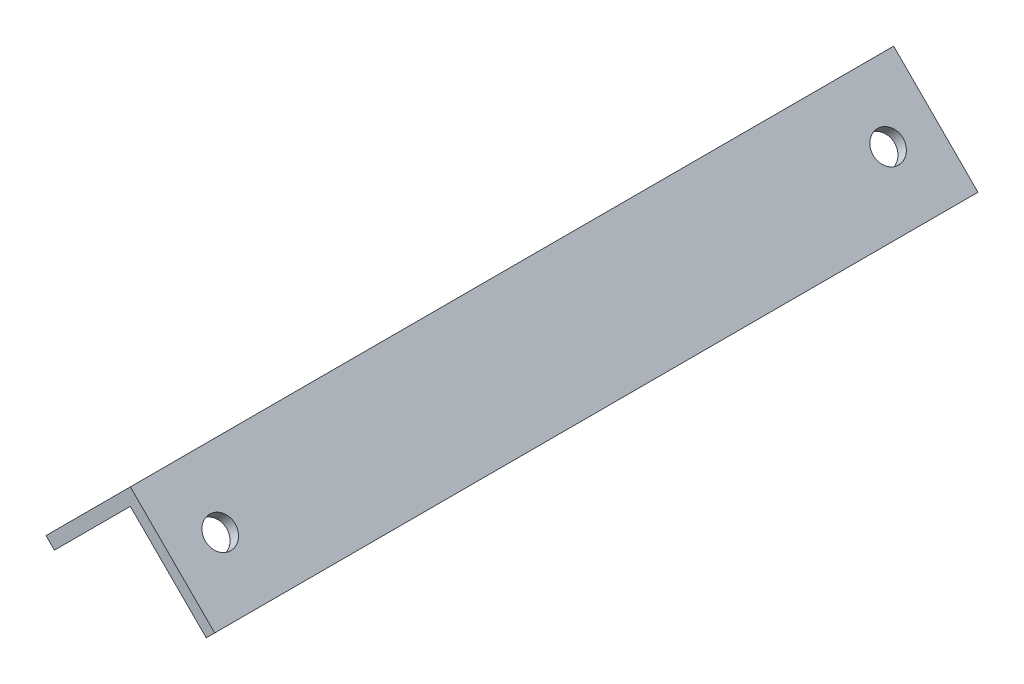
ISO-10303-21;
HEADER;
FILE_DESCRIPTION(('STEP AP214'),'2;1');
FILE_NAME('part.step','',(''),(''),'','','');
FILE_SCHEMA(('AUTOMOTIVE_DESIGN { 1 0 10303 214 1 1 1 1 }'));
ENDSEC;
DATA;
#1=APPLICATION_CONTEXT('core data for automotive mechanical design processes');
#2=APPLICATION_PROTOCOL_DEFINITION('international standard','automotive_design',2000,#1);
#3=PRODUCT_CONTEXT('',#1,'mechanical');
#4=PRODUCT('Part','Part','',(#3));
#5=PRODUCT_RELATED_PRODUCT_CATEGORY('part','',(#4));
#6=PRODUCT_DEFINITION_FORMATION('','',#4);
#7=PRODUCT_DEFINITION_CONTEXT('part definition',#1,'design');
#8=PRODUCT_DEFINITION('design','',#6,#7);
#9=PRODUCT_DEFINITION_SHAPE('','',#8);
#10=(LENGTH_UNIT() NAMED_UNIT(*) SI_UNIT(.MILLI.,.METRE.));
#11=(NAMED_UNIT(*) PLANE_ANGLE_UNIT() SI_UNIT($,.RADIAN.));
#12=(NAMED_UNIT(*) SI_UNIT($,.STERADIAN.) SOLID_ANGLE_UNIT());
#13=UNCERTAINTY_MEASURE_WITH_UNIT(LENGTH_MEASURE(1.E-05),#10,'distance_accuracy_value','');
#14=(GEOMETRIC_REPRESENTATION_CONTEXT(3) GLOBAL_UNCERTAINTY_ASSIGNED_CONTEXT((#13)) GLOBAL_UNIT_ASSIGNED_CONTEXT((#10,
#11,#12)) REPRESENTATION_CONTEXT('',''));
#15=CARTESIAN_POINT('',(0.,0.,0.));
#16=DIRECTION('',(0.,0.,1.));
#17=DIRECTION('',(1.,0.,0.));
#18=AXIS2_PLACEMENT_3D('',#15,#16,#17);
#19=CARTESIAN_POINT('',(42.6562165750785,-2.24506403026729,203.2));
#20=DIRECTION('',(0.707106781186548,0.707106781186547,0.));
#21=DIRECTION('',(-0.707106781186547,0.707106781186548,0.));
#22=AXIS2_PLACEMENT_3D('',#19,#20,#21);
#23=PLANE('',#22);
#24=DIRECTION('',(0.707106781186547,-0.707106781186548,0.));
#25=VECTOR('',#24,1.);
#26=CARTESIAN_POINT('',(42.6562165750785,-2.24506403026729,0.));
#27=LINE('',#26,#25);
#28=CARTESIAN_POINT('',(22.4506403026729,17.9605122421383,0.));
#29=VERTEX_POINT('',#28);
#30=CARTESIAN_POINT('',(42.6562165750785,-2.24506403026729,0.));
#31=VERTEX_POINT('',#30);
#32=EDGE_CURVE('E126',#29,#31,#27,.T.);
#33=ORIENTED_EDGE('',*,*,#32,.T.);
#34=DIRECTION('',(0.,0.,-1.));
#35=VECTOR('',#34,1.);
#36=CARTESIAN_POINT('',(42.6562165750785,-2.24506403026729,203.2));
#37=LINE('',#36,#35);
#38=CARTESIAN_POINT('',(42.6562165750785,-2.24506403026729,203.2));
#39=VERTEX_POINT('',#38);
#40=EDGE_CURVE('E110',#39,#31,#37,.T.);
#41=ORIENTED_EDGE('',*,*,#40,.F.);
#42=DIRECTION('',(0.707106781186547,-0.707106781186548,0.));
#43=VECTOR('',#42,1.);
#44=CARTESIAN_POINT('',(42.6562165750785,-2.24506403026729,203.2));
#45=LINE('',#44,#43);
#46=CARTESIAN_POINT('',(22.4506403026729,17.9605122421383,203.2));
#47=VERTEX_POINT('',#46);
#48=EDGE_CURVE('E101',#47,#39,#45,.T.);
#49=ORIENTED_EDGE('',*,*,#48,.F.);
#50=DIRECTION('',(0.,0.,-1.));
#51=VECTOR('',#50,1.);
#52=CARTESIAN_POINT('',(22.4506403026729,17.9605122421383,203.2));
#53=LINE('',#52,#51);
#54=EDGE_CURVE('E43',#47,#29,#53,.T.);
#55=ORIENTED_EDGE('',*,*,#54,.T.);
#56=EDGE_LOOP('',(#33,#41,#49,#55));
#57=FACE_BOUND('',#56,.T.);
#58=CARTESIAN_POINT('',(31.430896423742,8.98025612106917,12.7));
#59=DIRECTION('',(0.707106781186548,0.707106781186547,0.));
#60=DIRECTION('',(-0.707106781186547,0.707106781186548,0.));
#61=AXIS2_PLACEMENT_3D('',#58,#59,#60);
#62=CIRCLE('',#61,3.9751);
#63=CARTESIAN_POINT('',(28.6200762578474,11.7910762869638,12.7));
#64=VERTEX_POINT('',#63);
#65=EDGE_CURVE('E187',#64,#64,#62,.T.);
#66=ORIENTED_EDGE('',*,*,#65,.T.);
#67=EDGE_LOOP('',(#66));
#68=FACE_BOUND('',#67,.T.);
#69=CARTESIAN_POINT('',(31.430896423742,8.98025612106917,190.5));
#70=DIRECTION('',(0.707106781186548,0.707106781186547,0.));
#71=DIRECTION('',(-0.707106781186547,0.707106781186548,0.));
#72=AXIS2_PLACEMENT_3D('',#69,#70,#71);
#73=CIRCLE('',#72,3.9751);
#74=CARTESIAN_POINT('',(28.6200762578474,11.7910762869638,190.5));
#75=VERTEX_POINT('',#74);
#76=EDGE_CURVE('E193',#75,#75,#73,.F.);
#77=ORIENTED_EDGE('',*,*,#76,.F.);
#78=EDGE_LOOP('',(#77));
#79=FACE_BOUND('',#78,.T.);
#80=ADVANCED_FACE('F34',(#57,#68,#79),#23,.F.);
#81=CARTESIAN_POINT('',(22.4506403026729,22.4506403026729,203.2));
#82=DIRECTION('',(-0.707106781186548,-0.707106781186548,0.));
#83=DIRECTION('',(0.707106781186548,-0.707106781186547,0.));
#84=AXIS2_PLACEMENT_3D('',#81,#82,#83);
#85=PLANE('',#84);
#86=DIRECTION('',(-0.707106781186547,0.707106781186547,0.));
#87=VECTOR('',#86,1.);
#88=CARTESIAN_POINT('',(22.4506403026729,22.4506403026729,0.));
#89=LINE('',#88,#87);
#90=CARTESIAN_POINT('',(44.9012806053458,0.,0.));
#91=VERTEX_POINT('',#90);
#92=CARTESIAN_POINT('',(22.4506403026729,22.4506403026729,0.));
#93=VERTEX_POINT('',#92);
#94=EDGE_CURVE('E74',#91,#93,#89,.T.);
#95=ORIENTED_EDGE('',*,*,#94,.T.);
#96=DIRECTION('',(0.,0.,-1.));
#97=VECTOR('',#96,1.);
#98=CARTESIAN_POINT('',(22.4506403026729,22.4506403026729,203.2));
#99=LINE('',#98,#97);
#100=CARTESIAN_POINT('',(22.4506403026729,22.4506403026729,203.2));
#101=VERTEX_POINT('',#100);
#102=EDGE_CURVE('E111',#101,#93,#99,.T.);
#103=ORIENTED_EDGE('',*,*,#102,.F.);
#104=DIRECTION('',(-0.707106781186547,0.707106781186547,0.));
#105=VECTOR('',#104,1.);
#106=CARTESIAN_POINT('',(22.4506403026729,22.4506403026729,203.2));
#107=LINE('',#106,#105);
#108=CARTESIAN_POINT('',(44.9012806053458,0.,203.2));
#109=VERTEX_POINT('',#108);
#110=EDGE_CURVE('E99',#109,#101,#107,.T.);
#111=ORIENTED_EDGE('',*,*,#110,.F.);
#112=DIRECTION('',(0.,0.,-1.));
#113=VECTOR('',#112,1.);
#114=CARTESIAN_POINT('',(44.9012806053458,0.,203.2));
#115=LINE('',#114,#113);
#116=EDGE_CURVE('E106',#109,#91,#115,.T.);
#117=ORIENTED_EDGE('',*,*,#116,.T.);
#118=EDGE_LOOP('',(#95,#103,#111,#117));
#119=FACE_BOUND('',#118,.T.);
#120=CARTESIAN_POINT('',(33.6759604540093,11.2253201513365,12.7));
#121=DIRECTION('',(0.707106781186547,0.707106781186548,0.));
#122=DIRECTION('',(-0.707106781186548,0.707106781186547,0.));
#123=AXIS2_PLACEMENT_3D('',#120,#121,#122);
#124=CIRCLE('',#123,3.9751);
#125=CARTESIAN_POINT('',(30.8651402881147,14.0361403172311,12.7));
#126=VERTEX_POINT('',#125);
#127=EDGE_CURVE('E190',#126,#126,#124,.T.);
#128=ORIENTED_EDGE('',*,*,#127,.F.);
#129=EDGE_LOOP('',(#128));
#130=FACE_BOUND('',#129,.T.);
#131=CARTESIAN_POINT('',(33.6759604540093,11.2253201513365,190.5));
#132=DIRECTION('',(-0.707106781186547,-0.707106781186548,0.));
#133=DIRECTION('',(-0.707106781186548,0.707106781186547,0.));
#134=AXIS2_PLACEMENT_3D('',#131,#132,#133);
#135=CIRCLE('',#134,3.9751);
#136=CARTESIAN_POINT('',(30.8651402881147,14.0361403172311,190.5));
#137=VERTEX_POINT('',#136);
#138=EDGE_CURVE('E196',#137,#137,#135,.T.);
#139=ORIENTED_EDGE('',*,*,#138,.T.);
#140=EDGE_LOOP('',(#139));
#141=FACE_BOUND('',#140,.T.);
#142=ADVANCED_FACE('F113',(#119,#130,#141),#85,.F.);
#143=CARTESIAN_POINT('',(2.24506403026729,-2.24506403026729,203.2));
#144=DIRECTION('',(0.707106781186547,0.707106781186548,0.));
#145=DIRECTION('',(-0.707106781186548,0.707106781186547,0.));
#146=AXIS2_PLACEMENT_3D('',#143,#144,#145);
#147=PLANE('',#146);
#148=DIRECTION('',(0.707106781186548,-0.707106781186547,0.));
#149=VECTOR('',#148,1.);
#150=CARTESIAN_POINT('',(2.24506403026729,-2.24506403026729,0.));
#151=LINE('',#150,#149);
#152=CARTESIAN_POINT('',(0.,0.,0.));
#153=VERTEX_POINT('',#152);
#154=CARTESIAN_POINT('',(2.24506403026729,-2.24506403026729,0.));
#155=VERTEX_POINT('',#154);
#156=EDGE_CURVE('E120',#153,#155,#151,.T.);
#157=ORIENTED_EDGE('',*,*,#156,.T.);
#158=DIRECTION('',(0.,0.,-1.));
#159=VECTOR('',#158,1.);
#160=CARTESIAN_POINT('',(2.24506403026729,-2.24506403026729,203.2));
#161=LINE('',#160,#159);
#162=CARTESIAN_POINT('',(2.24506403026729,-2.24506403026729,203.2));
#163=VERTEX_POINT('',#162);
#164=EDGE_CURVE('E11',#163,#155,#161,.T.);
#165=ORIENTED_EDGE('',*,*,#164,.F.);
#166=DIRECTION('',(0.707106781186548,-0.707106781186547,0.));
#167=VECTOR('',#166,1.);
#168=CARTESIAN_POINT('',(2.24506403026729,-2.24506403026729,203.2));
#169=LINE('',#168,#167);
#170=CARTESIAN_POINT('',(0.,0.,203.2));
#171=VERTEX_POINT('',#170);
#172=EDGE_CURVE('E131',#171,#163,#169,.T.);
#173=ORIENTED_EDGE('',*,*,#172,.F.);
#174=DIRECTION('',(0.,0.,-1.));
#175=VECTOR('',#174,1.);
#176=CARTESIAN_POINT('',(0.,0.,203.2));
#177=LINE('',#176,#175);
#178=EDGE_CURVE('E116',#171,#153,#177,.T.);
#179=ORIENTED_EDGE('',*,*,#178,.T.);
#180=EDGE_LOOP('',(#157,#165,#173,#179));
#181=FACE_BOUND('',#180,.T.);
#182=ADVANCED_FACE('F36',(#181),#147,.F.);
#183=CARTESIAN_POINT('',(22.4506403026729,17.9605122421383,203.2));
#184=DIRECTION('',(-0.707106781186548,0.707106781186548,0.));
#185=DIRECTION('',(-0.707106781186548,-0.707106781186547,0.));
#186=AXIS2_PLACEMENT_3D('',#183,#184,#185);
#187=PLANE('',#186);
#188=CARTESIAN_POINT('',(13.4703841816037,8.98025612106914,171.45));
#189=DIRECTION('',(-0.707106781186548,0.707106781186548,0.));
#190=DIRECTION('',(-0.707106781186548,-0.707106781186547,0.));
#191=AXIS2_PLACEMENT_3D('',#188,#189,#190);
#192=CIRCLE('',#191,3.97510000000001);
#193=CARTESIAN_POINT('',(10.6595640157091,6.16943595517449,171.45));
#194=VERTEX_POINT('',#193);
#195=EDGE_CURVE('E172',#194,#194,#192,.T.);
#196=ORIENTED_EDGE('',*,*,#195,.T.);
#197=EDGE_LOOP('',(#196));
#198=FACE_BOUND('',#197,.T.);
#199=CARTESIAN_POINT('',(13.4703841816037,8.98025612106914,31.75));
#200=DIRECTION('',(-0.707106781186548,0.707106781186548,0.));
#201=DIRECTION('',(-0.707106781186548,-0.707106781186547,0.));
#202=AXIS2_PLACEMENT_3D('',#199,#200,#201);
#203=CIRCLE('',#202,3.9751);
#204=CARTESIAN_POINT('',(10.6595640157091,6.1694359551745,31.75));
#205=VERTEX_POINT('',#204);
#206=EDGE_CURVE('E124',#205,#205,#203,.T.);
#207=ORIENTED_EDGE('',*,*,#206,.T.);
#208=EDGE_LOOP('',(#207));
#209=FACE_BOUND('',#208,.T.);
#210=DIRECTION('',(0.707106781186547,0.707106781186547,0.));
#211=VECTOR('',#210,1.);
#212=CARTESIAN_POINT('',(22.4506403026729,17.9605122421383,0.));
#213=LINE('',#212,#211);
#214=EDGE_CURVE('E123',#155,#29,#213,.T.);
#215=ORIENTED_EDGE('',*,*,#214,.T.);
#216=ORIENTED_EDGE('',*,*,#54,.F.);
#217=DIRECTION('',(0.707106781186547,0.707106781186547,0.));
#218=VECTOR('',#217,1.);
#219=CARTESIAN_POINT('',(22.4506403026729,17.9605122421383,203.2));
#220=LINE('',#219,#218);
#221=EDGE_CURVE('E88',#163,#47,#220,.T.);
#222=ORIENTED_EDGE('',*,*,#221,.F.);
#223=ORIENTED_EDGE('',*,*,#164,.T.);
#224=EDGE_LOOP('',(#215,#216,#222,#223));
#225=FACE_BOUND('',#224,.T.);
#226=ADVANCED_FACE('F153',(#198,#209,#225),#187,.F.);
#227=CARTESIAN_POINT('',(44.9012806053458,0.,203.2));
#228=DIRECTION('',(-0.707106781186547,0.707106781186548,0.));
#229=DIRECTION('',(-0.707106781186548,-0.707106781186547,0.));
#230=AXIS2_PLACEMENT_3D('',#227,#228,#229);
#231=PLANE('',#230);
#232=DIRECTION('',(0.707106781186548,0.707106781186547,0.));
#233=VECTOR('',#232,1.);
#234=CARTESIAN_POINT('',(44.9012806053458,0.,0.));
#235=LINE('',#234,#233);
#236=EDGE_CURVE('E109',#31,#91,#235,.T.);
#237=ORIENTED_EDGE('',*,*,#236,.T.);
#238=ORIENTED_EDGE('',*,*,#116,.F.);
#239=DIRECTION('',(0.707106781186548,0.707106781186547,0.));
#240=VECTOR('',#239,1.);
#241=CARTESIAN_POINT('',(44.9012806053458,0.,203.2));
#242=LINE('',#241,#240);
#243=EDGE_CURVE('E95',#39,#109,#242,.T.);
#244=ORIENTED_EDGE('',*,*,#243,.F.);
#245=ORIENTED_EDGE('',*,*,#40,.T.);
#246=EDGE_LOOP('',(#237,#238,#244,#245));
#247=FACE_BOUND('',#246,.T.);
#248=ADVANCED_FACE('F107',(#247),#231,.F.);
#249=CARTESIAN_POINT('',(0.,0.,203.2));
#250=DIRECTION('',(0.707106781186548,-0.707106781186547,0.));
#251=DIRECTION('',(0.707106781186547,0.707106781186548,0.));
#252=AXIS2_PLACEMENT_3D('',#249,#250,#251);
#253=PLANE('',#252);
#254=CARTESIAN_POINT('',(11.2253201513364,11.2253201513364,171.45));
#255=DIRECTION('',(-0.707106781186548,0.707106781186547,0.));
#256=DIRECTION('',(-0.707106781186547,-0.707106781186548,0.));
#257=AXIS2_PLACEMENT_3D('',#254,#255,#256);
#258=CIRCLE('',#257,3.97510000000001);
#259=CARTESIAN_POINT('',(8.41449998544178,8.41449998544179,171.45));
#260=VERTEX_POINT('',#259);
#261=EDGE_CURVE('E184',#260,#260,#258,.T.);
#262=ORIENTED_EDGE('',*,*,#261,.F.);
#263=EDGE_LOOP('',(#262));
#264=FACE_BOUND('',#263,.T.);
#265=CARTESIAN_POINT('',(11.2253201513364,11.2253201513364,31.75));
#266=DIRECTION('',(-0.707106781186548,0.707106781186547,0.));
#267=DIRECTION('',(-0.707106781186547,-0.707106781186548,0.));
#268=AXIS2_PLACEMENT_3D('',#265,#266,#267);
#269=CIRCLE('',#268,3.9751);
#270=CARTESIAN_POINT('',(8.41449998544179,8.41449998544179,31.75));
#271=VERTEX_POINT('',#270);
#272=EDGE_CURVE('E176',#271,#271,#269,.T.);
#273=ORIENTED_EDGE('',*,*,#272,.F.);
#274=EDGE_LOOP('',(#273));
#275=FACE_BOUND('',#274,.T.);
#276=DIRECTION('',(-0.707106781186547,-0.707106781186548,0.));
#277=VECTOR('',#276,1.);
#278=CARTESIAN_POINT('',(0.,0.,0.));
#279=LINE('',#278,#277);
#280=EDGE_CURVE('E80',#93,#153,#279,.T.);
#281=ORIENTED_EDGE('',*,*,#280,.T.);
#282=ORIENTED_EDGE('',*,*,#178,.F.);
#283=DIRECTION('',(-0.707106781186547,-0.707106781186548,0.));
#284=VECTOR('',#283,1.);
#285=CARTESIAN_POINT('',(0.,0.,203.2));
#286=LINE('',#285,#284);
#287=EDGE_CURVE('E51',#101,#171,#286,.T.);
#288=ORIENTED_EDGE('',*,*,#287,.F.);
#289=ORIENTED_EDGE('',*,*,#102,.T.);
#290=EDGE_LOOP('',(#281,#282,#288,#289));
#291=FACE_BOUND('',#290,.T.);
#292=ADVANCED_FACE('F144',(#264,#275,#291),#253,.F.);
#293=CARTESIAN_POINT('',(0.,0.,203.2));
#294=DIRECTION('',(0.,0.,-1.));
#295=DIRECTION('',(-1.,0.,0.));
#296=AXIS2_PLACEMENT_3D('',#293,#294,#295);
#297=PLANE('',#296);
#298=ORIENTED_EDGE('',*,*,#172,.T.);
#299=ORIENTED_EDGE('',*,*,#221,.T.);
#300=ORIENTED_EDGE('',*,*,#48,.T.);
#301=ORIENTED_EDGE('',*,*,#243,.T.);
#302=ORIENTED_EDGE('',*,*,#110,.T.);
#303=ORIENTED_EDGE('',*,*,#287,.T.);
#304=EDGE_LOOP('',(#298,#299,#300,#301,#302,#303));
#305=FACE_BOUND('',#304,.T.);
#306=ADVANCED_FACE('F97',(#305),#297,.F.);
#307=CARTESIAN_POINT('',(0.,0.,0.));
#308=DIRECTION('',(0.,0.,-1.));
#309=DIRECTION('',(-1.,0.,0.));
#310=AXIS2_PLACEMENT_3D('',#307,#308,#309);
#311=PLANE('',#310);
#312=ORIENTED_EDGE('',*,*,#156,.F.);
#313=ORIENTED_EDGE('',*,*,#280,.F.);
#314=ORIENTED_EDGE('',*,*,#94,.F.);
#315=ORIENTED_EDGE('',*,*,#236,.F.);
#316=ORIENTED_EDGE('',*,*,#32,.F.);
#317=ORIENTED_EDGE('',*,*,#214,.F.);
#318=EDGE_LOOP('',(#312,#313,#314,#315,#316,#317));
#319=FACE_BOUND('',#318,.T.);
#320=ADVANCED_FACE('F140',(#319),#311,.T.);
#321=CARTESIAN_POINT('',(34.798492469143,-12.3478521664701,31.75));
#322=DIRECTION('',(-0.707106781186548,0.707106781186547,0.));
#323=DIRECTION('',(-0.707106781186547,-0.707106781186548,0.));
#324=AXIS2_PLACEMENT_3D('',#321,#322,#323);
#325=CYLINDRICAL_SURFACE('',#324,3.9751);
#326=ORIENTED_EDGE('',*,*,#272,.T.);
#327=EDGE_LOOP('',(#326));
#328=FACE_BOUND('',#327,.T.);
#329=ORIENTED_EDGE('',*,*,#206,.F.);
#330=EDGE_LOOP('',(#329));
#331=FACE_BOUND('',#330,.T.);
#332=ADVANCED_FACE('F217',(#328,#331),#325,.F.);
#333=CARTESIAN_POINT('',(34.798492469143,-12.3478521664701,171.45));
#334=DIRECTION('',(-0.707106781186548,0.707106781186547,0.));
#335=DIRECTION('',(-0.707106781186547,-0.707106781186548,0.));
#336=AXIS2_PLACEMENT_3D('',#333,#334,#335);
#337=CYLINDRICAL_SURFACE('',#336,3.97510000000001);
#338=ORIENTED_EDGE('',*,*,#261,.T.);
#339=EDGE_LOOP('',(#338));
#340=FACE_BOUND('',#339,.T.);
#341=ORIENTED_EDGE('',*,*,#195,.F.);
#342=EDGE_LOOP('',(#341));
#343=FACE_BOUND('',#342,.T.);
#344=ADVANCED_FACE('F211',(#340,#343),#337,.F.);
#345=CARTESIAN_POINT('',(10.1027881362028,-12.3478521664701,12.7));
#346=DIRECTION('',(0.707106781186547,0.707106781186548,0.));
#347=DIRECTION('',(-0.707106781186548,0.707106781186547,0.));
#348=AXIS2_PLACEMENT_3D('',#345,#346,#347);
#349=CYLINDRICAL_SURFACE('',#348,3.9751);
#350=ORIENTED_EDGE('',*,*,#127,.T.);
#351=EDGE_LOOP('',(#350));
#352=FACE_BOUND('',#351,.T.);
#353=ORIENTED_EDGE('',*,*,#65,.F.);
#354=EDGE_LOOP('',(#353));
#355=FACE_BOUND('',#354,.T.);
#356=ADVANCED_FACE('F204',(#352,#355),#349,.F.);
#357=CARTESIAN_POINT('',(10.1027881362028,-12.3478521664701,190.5));
#358=DIRECTION('',(0.707106781186547,0.707106781186548,0.));
#359=DIRECTION('',(-0.707106781186548,0.707106781186547,0.));
#360=AXIS2_PLACEMENT_3D('',#357,#358,#359);
#361=CYLINDRICAL_SURFACE('',#360,3.9751);
#362=ORIENTED_EDGE('',*,*,#138,.F.);
#363=EDGE_LOOP('',(#362));
#364=FACE_BOUND('',#363,.T.);
#365=ORIENTED_EDGE('',*,*,#76,.T.);
#366=EDGE_LOOP('',(#365));
#367=FACE_BOUND('',#366,.T.);
#368=ADVANCED_FACE('F201',(#364,#367),#361,.F.);
#369=CLOSED_SHELL('',(#80,#142,#182,#226,#248,#292,#306,#320,#332,#344,#356,#368));
#370=MANIFOLD_SOLID_BREP('B2',#369);
#371=ADVANCED_BREP_SHAPE_REPRESENTATION('',(#18,#370),#14);
#372=SHAPE_DEFINITION_REPRESENTATION(#9,#371);
ENDSEC;
END-ISO-10303-21;
